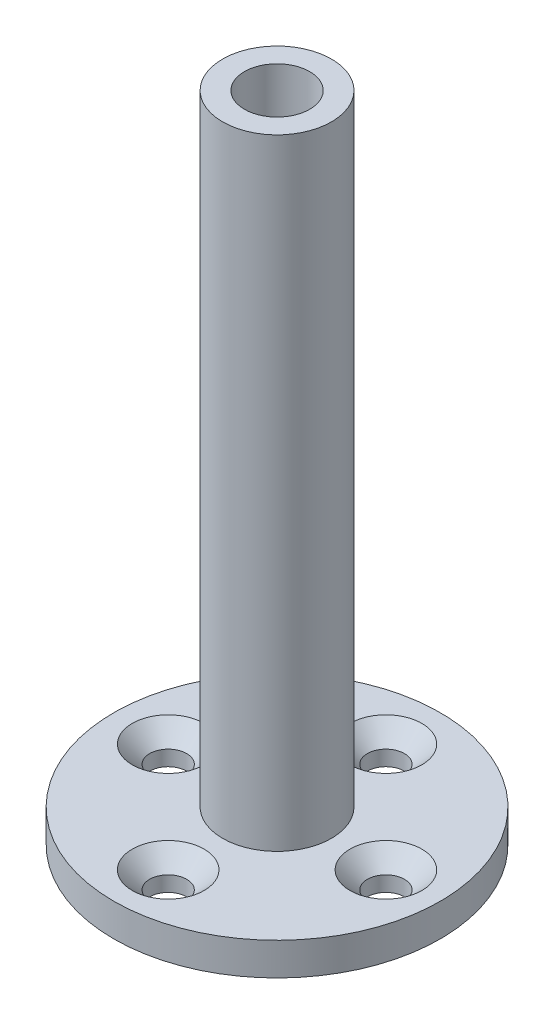
ISO-10303-21;
HEADER;
FILE_DESCRIPTION(('STEP AP214'),'2;1');
FILE_NAME('part.step','',(''),(''),'','','');
FILE_SCHEMA(('AUTOMOTIVE_DESIGN { 1 0 10303 214 1 1 1 1 }'));
ENDSEC;
DATA;
#1=APPLICATION_CONTEXT('core data for automotive mechanical design processes');
#2=APPLICATION_PROTOCOL_DEFINITION('international standard','automotive_design',2000,#1);
#3=PRODUCT_CONTEXT('',#1,'mechanical');
#4=PRODUCT('Part','Part','',(#3));
#5=PRODUCT_RELATED_PRODUCT_CATEGORY('part','',(#4));
#6=PRODUCT_DEFINITION_FORMATION('','',#4);
#7=PRODUCT_DEFINITION_CONTEXT('part definition',#1,'design');
#8=PRODUCT_DEFINITION('design','',#6,#7);
#9=PRODUCT_DEFINITION_SHAPE('','',#8);
#10=(LENGTH_UNIT() NAMED_UNIT(*) SI_UNIT(.MILLI.,.METRE.));
#11=(NAMED_UNIT(*) PLANE_ANGLE_UNIT() SI_UNIT($,.RADIAN.));
#12=(NAMED_UNIT(*) SI_UNIT($,.STERADIAN.) SOLID_ANGLE_UNIT());
#13=UNCERTAINTY_MEASURE_WITH_UNIT(LENGTH_MEASURE(1.E-05),#10,'distance_accuracy_value','');
#14=(GEOMETRIC_REPRESENTATION_CONTEXT(3) GLOBAL_UNCERTAINTY_ASSIGNED_CONTEXT((#13)) GLOBAL_UNIT_ASSIGNED_CONTEXT((#10,
#11,#12)) REPRESENTATION_CONTEXT('',''));
#15=CARTESIAN_POINT('',(0.,0.,0.));
#16=DIRECTION('',(0.,0.,1.));
#17=DIRECTION('',(1.,0.,0.));
#18=AXIS2_PLACEMENT_3D('',#15,#16,#17);
#19=CARTESIAN_POINT('',(0.,60.,0.));
#20=DIRECTION('',(0.,-1.,0.));
#21=DIRECTION('',(0.,0.,-1.));
#22=AXIS2_PLACEMENT_3D('',#19,#20,#21);
#23=CYLINDRICAL_SURFACE('',#22,3.);
#24=CARTESIAN_POINT('',(0.,60.,0.));
#25=DIRECTION('',(0.,1.,0.));
#26=DIRECTION('',(0.,0.,1.));
#27=AXIS2_PLACEMENT_3D('',#24,#25,#26);
#28=CIRCLE('',#27,3.);
#29=CARTESIAN_POINT('',(0.,60.,3.));
#30=VERTEX_POINT('',#29);
#31=EDGE_CURVE('E38',#30,#30,#28,.T.);
#32=ORIENTED_EDGE('',*,*,#31,.T.);
#33=EDGE_LOOP('',(#32));
#34=FACE_BOUND('',#33,.T.);
#35=CARTESIAN_POINT('',(0.,0.,0.));
#36=DIRECTION('',(0.,1.,0.));
#37=DIRECTION('',(0.,0.,1.));
#38=AXIS2_PLACEMENT_3D('',#35,#36,#37);
#39=CIRCLE('',#38,3.);
#40=CARTESIAN_POINT('',(0.,0.,3.));
#41=VERTEX_POINT('',#40);
#42=EDGE_CURVE('E34',#41,#41,#39,.T.);
#43=ORIENTED_EDGE('',*,*,#42,.F.);
#44=EDGE_LOOP('',(#43));
#45=FACE_BOUND('',#44,.T.);
#46=ADVANCED_FACE('F31',(#34,#45),#23,.F.);
#47=CARTESIAN_POINT('',(0.,60.,0.));
#48=DIRECTION('',(0.,-1.,0.));
#49=DIRECTION('',(0.,0.,-1.));
#50=AXIS2_PLACEMENT_3D('',#47,#48,#49);
#51=CYLINDRICAL_SURFACE('',#50,5.);
#52=CARTESIAN_POINT('',(0.,3.,0.));
#53=DIRECTION('',(0.,1.,0.));
#54=DIRECTION('',(0.,0.,1.));
#55=AXIS2_PLACEMENT_3D('',#52,#53,#54);
#56=CIRCLE('',#55,5.);
#57=CARTESIAN_POINT('',(0.,3.,5.));
#58=VERTEX_POINT('',#57);
#59=EDGE_CURVE('E48',#58,#58,#56,.T.);
#60=ORIENTED_EDGE('',*,*,#59,.T.);
#61=EDGE_LOOP('',(#60));
#62=FACE_BOUND('',#61,.T.);
#63=CARTESIAN_POINT('',(0.,60.,0.));
#64=DIRECTION('',(0.,1.,0.));
#65=DIRECTION('',(0.,0.,1.));
#66=AXIS2_PLACEMENT_3D('',#63,#64,#65);
#67=CIRCLE('',#66,5.);
#68=CARTESIAN_POINT('',(0.,60.,5.));
#69=VERTEX_POINT('',#68);
#70=EDGE_CURVE('E10',#69,#69,#67,.T.);
#71=ORIENTED_EDGE('',*,*,#70,.F.);
#72=EDGE_LOOP('',(#71));
#73=FACE_BOUND('',#72,.T.);
#74=ADVANCED_FACE('F108',(#62,#73),#51,.T.);
#75=CARTESIAN_POINT('',(0.,60.,0.));
#76=DIRECTION('',(0.,1.,0.));
#77=DIRECTION('',(0.,0.,1.));
#78=AXIS2_PLACEMENT_3D('',#75,#76,#77);
#79=PLANE('',#78);
#80=ORIENTED_EDGE('',*,*,#31,.F.);
#81=EDGE_LOOP('',(#80));
#82=FACE_BOUND('',#81,.T.);
#83=ORIENTED_EDGE('',*,*,#70,.T.);
#84=EDGE_LOOP('',(#83));
#85=FACE_BOUND('',#84,.T.);
#86=ADVANCED_FACE('F111',(#82,#85),#79,.T.);
#87=CARTESIAN_POINT('',(0.,0.,0.));
#88=DIRECTION('',(0.,1.,0.));
#89=DIRECTION('',(0.,0.,1.));
#90=AXIS2_PLACEMENT_3D('',#87,#88,#89);
#91=PLANE('',#90);
#92=CARTESIAN_POINT('',(-10.,0.,0.));
#93=DIRECTION('',(0.,1.,0.));
#94=DIRECTION('',(0.,0.,1.));
#95=AXIS2_PLACEMENT_3D('',#92,#93,#94);
#96=CIRCLE('',#95,1.7);
#97=CARTESIAN_POINT('',(-10.,0.,1.7));
#98=VERTEX_POINT('',#97);
#99=EDGE_CURVE('E80',#98,#98,#96,.T.);
#100=ORIENTED_EDGE('',*,*,#99,.T.);
#101=EDGE_LOOP('',(#100));
#102=FACE_BOUND('',#101,.T.);
#103=CARTESIAN_POINT('',(0.,0.,10.));
#104=DIRECTION('',(0.,1.,0.));
#105=DIRECTION('',(0.,0.,1.));
#106=AXIS2_PLACEMENT_3D('',#103,#104,#105);
#107=CIRCLE('',#106,1.7);
#108=CARTESIAN_POINT('',(0.,0.,11.7));
#109=VERTEX_POINT('',#108);
#110=EDGE_CURVE('E71',#109,#109,#107,.T.);
#111=ORIENTED_EDGE('',*,*,#110,.T.);
#112=EDGE_LOOP('',(#111));
#113=FACE_BOUND('',#112,.T.);
#114=CARTESIAN_POINT('',(10.,0.,0.));
#115=DIRECTION('',(0.,1.,0.));
#116=DIRECTION('',(0.,0.,1.));
#117=AXIS2_PLACEMENT_3D('',#114,#115,#116);
#118=CIRCLE('',#117,1.7);
#119=CARTESIAN_POINT('',(10.,0.,1.7));
#120=VERTEX_POINT('',#119);
#121=EDGE_CURVE('E62',#120,#120,#118,.T.);
#122=ORIENTED_EDGE('',*,*,#121,.T.);
#123=EDGE_LOOP('',(#122));
#124=FACE_BOUND('',#123,.T.);
#125=CARTESIAN_POINT('',(0.,0.,-10.));
#126=DIRECTION('',(0.,1.,0.));
#127=DIRECTION('',(0.,0.,1.));
#128=AXIS2_PLACEMENT_3D('',#125,#126,#127);
#129=CIRCLE('',#128,1.7);
#130=CARTESIAN_POINT('',(0.,0.,-8.3));
#131=VERTEX_POINT('',#130);
#132=EDGE_CURVE('E53',#131,#131,#129,.T.);
#133=ORIENTED_EDGE('',*,*,#132,.T.);
#134=EDGE_LOOP('',(#133));
#135=FACE_BOUND('',#134,.T.);
#136=ORIENTED_EDGE('',*,*,#42,.T.);
#137=EDGE_LOOP('',(#136));
#138=FACE_BOUND('',#137,.T.);
#139=CARTESIAN_POINT('',(0.,0.,0.));
#140=DIRECTION('',(0.,1.,0.));
#141=DIRECTION('',(0.,0.,1.));
#142=AXIS2_PLACEMENT_3D('',#139,#140,#141);
#143=CIRCLE('',#142,15.);
#144=CARTESIAN_POINT('',(0.,0.,15.));
#145=VERTEX_POINT('',#144);
#146=EDGE_CURVE('E44',#145,#145,#143,.T.);
#147=ORIENTED_EDGE('',*,*,#146,.F.);
#148=EDGE_LOOP('',(#147));
#149=FACE_BOUND('',#148,.T.);
#150=ADVANCED_FACE('F96',(#102,#113,#124,#135,#138,#149),#91,.F.);
#151=CARTESIAN_POINT('',(0.,3.,0.));
#152=DIRECTION('',(0.,1.,0.));
#153=DIRECTION('',(0.,0.,1.));
#154=AXIS2_PLACEMENT_3D('',#151,#152,#153);
#155=PLANE('',#154);
#156=CARTESIAN_POINT('',(-10.,3.,0.));
#157=DIRECTION('',(0.,1.,0.));
#158=DIRECTION('',(0.,0.,1.));
#159=AXIS2_PLACEMENT_3D('',#156,#157,#158);
#160=CIRCLE('',#159,3.3);
#161=CARTESIAN_POINT('',(-10.,3.,3.3));
#162=VERTEX_POINT('',#161);
#163=EDGE_CURVE('E86',#162,#162,#160,.T.);
#164=ORIENTED_EDGE('',*,*,#163,.F.);
#165=EDGE_LOOP('',(#164));
#166=FACE_BOUND('',#165,.T.);
#167=CARTESIAN_POINT('',(0.,3.,10.));
#168=DIRECTION('',(0.,1.,0.));
#169=DIRECTION('',(0.,0.,1.));
#170=AXIS2_PLACEMENT_3D('',#167,#168,#169);
#171=CIRCLE('',#170,3.3);
#172=CARTESIAN_POINT('',(0.,3.,13.3));
#173=VERTEX_POINT('',#172);
#174=EDGE_CURVE('E77',#173,#173,#171,.T.);
#175=ORIENTED_EDGE('',*,*,#174,.F.);
#176=EDGE_LOOP('',(#175));
#177=FACE_BOUND('',#176,.T.);
#178=CARTESIAN_POINT('',(10.,3.,0.));
#179=DIRECTION('',(0.,1.,0.));
#180=DIRECTION('',(0.,0.,1.));
#181=AXIS2_PLACEMENT_3D('',#178,#179,#180);
#182=CIRCLE('',#181,3.3);
#183=CARTESIAN_POINT('',(10.,3.,3.3));
#184=VERTEX_POINT('',#183);
#185=EDGE_CURVE('E68',#184,#184,#182,.T.);
#186=ORIENTED_EDGE('',*,*,#185,.F.);
#187=EDGE_LOOP('',(#186));
#188=FACE_BOUND('',#187,.T.);
#189=CARTESIAN_POINT('',(0.,3.,-10.));
#190=DIRECTION('',(0.,1.,0.));
#191=DIRECTION('',(0.,0.,1.));
#192=AXIS2_PLACEMENT_3D('',#189,#190,#191);
#193=CIRCLE('',#192,3.3);
#194=CARTESIAN_POINT('',(0.,3.,-6.7));
#195=VERTEX_POINT('',#194);
#196=EDGE_CURVE('E59',#195,#195,#193,.T.);
#197=ORIENTED_EDGE('',*,*,#196,.F.);
#198=EDGE_LOOP('',(#197));
#199=FACE_BOUND('',#198,.T.);
#200=CARTESIAN_POINT('',(0.,3.,0.));
#201=DIRECTION('',(0.,1.,0.));
#202=DIRECTION('',(0.,0.,1.));
#203=AXIS2_PLACEMENT_3D('',#200,#201,#202);
#204=CIRCLE('',#203,15.);
#205=CARTESIAN_POINT('',(0.,3.,15.));
#206=VERTEX_POINT('',#205);
#207=EDGE_CURVE('E47',#206,#206,#204,.T.);
#208=ORIENTED_EDGE('',*,*,#207,.T.);
#209=EDGE_LOOP('',(#208));
#210=FACE_BOUND('',#209,.T.);
#211=ORIENTED_EDGE('',*,*,#59,.F.);
#212=EDGE_LOOP('',(#211));
#213=FACE_BOUND('',#212,.T.);
#214=ADVANCED_FACE('F92',(#166,#177,#188,#199,#210,#213),#155,.T.);
#215=CARTESIAN_POINT('',(0.,3.,0.));
#216=DIRECTION('',(0.,-1.,0.));
#217=DIRECTION('',(0.,0.,-1.));
#218=AXIS2_PLACEMENT_3D('',#215,#216,#217);
#219=CYLINDRICAL_SURFACE('',#218,15.);
#220=ORIENTED_EDGE('',*,*,#207,.F.);
#221=EDGE_LOOP('',(#220));
#222=FACE_BOUND('',#221,.T.);
#223=ORIENTED_EDGE('',*,*,#146,.T.);
#224=EDGE_LOOP('',(#223));
#225=FACE_BOUND('',#224,.T.);
#226=ADVANCED_FACE('F95',(#222,#225),#219,.T.);
#227=CARTESIAN_POINT('',(0.,3.,-10.));
#228=DIRECTION('',(0.,1.,0.));
#229=DIRECTION('',(0.,0.,1.));
#230=AXIS2_PLACEMENT_3D('',#227,#228,#229);
#231=CYLINDRICAL_SURFACE('',#230,1.7);
#232=ORIENTED_EDGE('',*,*,#132,.F.);
#233=EDGE_LOOP('',(#232));
#234=FACE_BOUND('',#233,.T.);
#235=CARTESIAN_POINT('',(0.,1.4,-10.));
#236=DIRECTION('',(0.,1.,0.));
#237=DIRECTION('',(0.,0.,1.));
#238=AXIS2_PLACEMENT_3D('',#235,#236,#237);
#239=CIRCLE('',#238,1.7);
#240=CARTESIAN_POINT('',(0.,1.4,-8.3));
#241=VERTEX_POINT('',#240);
#242=EDGE_CURVE('E56',#241,#241,#239,.T.);
#243=ORIENTED_EDGE('',*,*,#242,.T.);
#244=EDGE_LOOP('',(#243));
#245=FACE_BOUND('',#244,.T.);
#246=ADVANCED_FACE('F124',(#234,#245),#231,.F.);
#247=CARTESIAN_POINT('',(0.,3.,-10.));
#248=DIRECTION('',(0.,1.,0.));
#249=DIRECTION('',(0.,0.,1.));
#250=AXIS2_PLACEMENT_3D('',#247,#248,#249);
#251=CONICAL_SURFACE('',#250,3.3,0.785398163397449);
#252=ORIENTED_EDGE('',*,*,#242,.F.);
#253=EDGE_LOOP('',(#252));
#254=FACE_BOUND('',#253,.T.);
#255=ORIENTED_EDGE('',*,*,#196,.T.);
#256=EDGE_LOOP('',(#255));
#257=FACE_BOUND('',#256,.T.);
#258=ADVANCED_FACE('F129',(#254,#257),#251,.F.);
#259=CARTESIAN_POINT('',(10.,3.,0.));
#260=DIRECTION('',(0.,1.,0.));
#261=DIRECTION('',(0.,0.,1.));
#262=AXIS2_PLACEMENT_3D('',#259,#260,#261);
#263=CYLINDRICAL_SURFACE('',#262,1.7);
#264=ORIENTED_EDGE('',*,*,#121,.F.);
#265=EDGE_LOOP('',(#264));
#266=FACE_BOUND('',#265,.T.);
#267=CARTESIAN_POINT('',(10.,1.4,0.));
#268=DIRECTION('',(0.,1.,0.));
#269=DIRECTION('',(0.,0.,1.));
#270=AXIS2_PLACEMENT_3D('',#267,#268,#269);
#271=CIRCLE('',#270,1.7);
#272=CARTESIAN_POINT('',(10.,1.4,1.7));
#273=VERTEX_POINT('',#272);
#274=EDGE_CURVE('E65',#273,#273,#271,.T.);
#275=ORIENTED_EDGE('',*,*,#274,.T.);
#276=EDGE_LOOP('',(#275));
#277=FACE_BOUND('',#276,.T.);
#278=ADVANCED_FACE('F133',(#266,#277),#263,.F.);
#279=CARTESIAN_POINT('',(10.,3.,0.));
#280=DIRECTION('',(0.,1.,0.));
#281=DIRECTION('',(0.,0.,1.));
#282=AXIS2_PLACEMENT_3D('',#279,#280,#281);
#283=CONICAL_SURFACE('',#282,3.3,0.785398163397448);
#284=ORIENTED_EDGE('',*,*,#274,.F.);
#285=EDGE_LOOP('',(#284));
#286=FACE_BOUND('',#285,.T.);
#287=ORIENTED_EDGE('',*,*,#185,.T.);
#288=EDGE_LOOP('',(#287));
#289=FACE_BOUND('',#288,.T.);
#290=ADVANCED_FACE('F137',(#286,#289),#283,.F.);
#291=CARTESIAN_POINT('',(0.,3.,10.));
#292=DIRECTION('',(0.,1.,0.));
#293=DIRECTION('',(0.,0.,1.));
#294=AXIS2_PLACEMENT_3D('',#291,#292,#293);
#295=CYLINDRICAL_SURFACE('',#294,1.7);
#296=ORIENTED_EDGE('',*,*,#110,.F.);
#297=EDGE_LOOP('',(#296));
#298=FACE_BOUND('',#297,.T.);
#299=CARTESIAN_POINT('',(0.,1.4,10.));
#300=DIRECTION('',(0.,1.,0.));
#301=DIRECTION('',(0.,0.,1.));
#302=AXIS2_PLACEMENT_3D('',#299,#300,#301);
#303=CIRCLE('',#302,1.7);
#304=CARTESIAN_POINT('',(0.,1.4,11.7));
#305=VERTEX_POINT('',#304);
#306=EDGE_CURVE('E74',#305,#305,#303,.T.);
#307=ORIENTED_EDGE('',*,*,#306,.T.);
#308=EDGE_LOOP('',(#307));
#309=FACE_BOUND('',#308,.T.);
#310=ADVANCED_FACE('F141',(#298,#309),#295,.F.);
#311=CARTESIAN_POINT('',(0.,3.,10.));
#312=DIRECTION('',(0.,1.,0.));
#313=DIRECTION('',(0.,0.,1.));
#314=AXIS2_PLACEMENT_3D('',#311,#312,#313);
#315=CONICAL_SURFACE('',#314,3.3,0.785398163397449);
#316=ORIENTED_EDGE('',*,*,#306,.F.);
#317=EDGE_LOOP('',(#316));
#318=FACE_BOUND('',#317,.T.);
#319=ORIENTED_EDGE('',*,*,#174,.T.);
#320=EDGE_LOOP('',(#319));
#321=FACE_BOUND('',#320,.T.);
#322=ADVANCED_FACE('F145',(#318,#321),#315,.F.);
#323=CARTESIAN_POINT('',(-10.,3.,0.));
#324=DIRECTION('',(0.,1.,0.));
#325=DIRECTION('',(0.,0.,1.));
#326=AXIS2_PLACEMENT_3D('',#323,#324,#325);
#327=CYLINDRICAL_SURFACE('',#326,1.7);
#328=ORIENTED_EDGE('',*,*,#99,.F.);
#329=EDGE_LOOP('',(#328));
#330=FACE_BOUND('',#329,.T.);
#331=CARTESIAN_POINT('',(-10.,1.4,0.));
#332=DIRECTION('',(0.,1.,0.));
#333=DIRECTION('',(0.,0.,1.));
#334=AXIS2_PLACEMENT_3D('',#331,#332,#333);
#335=CIRCLE('',#334,1.7);
#336=CARTESIAN_POINT('',(-10.,1.4,1.7));
#337=VERTEX_POINT('',#336);
#338=EDGE_CURVE('E83',#337,#337,#335,.T.);
#339=ORIENTED_EDGE('',*,*,#338,.T.);
#340=EDGE_LOOP('',(#339));
#341=FACE_BOUND('',#340,.T.);
#342=ADVANCED_FACE('F149',(#330,#341),#327,.F.);
#343=CARTESIAN_POINT('',(-10.,3.,0.));
#344=DIRECTION('',(0.,1.,0.));
#345=DIRECTION('',(0.,0.,1.));
#346=AXIS2_PLACEMENT_3D('',#343,#344,#345);
#347=CONICAL_SURFACE('',#346,3.3,0.785398163397449);
#348=ORIENTED_EDGE('',*,*,#338,.F.);
#349=EDGE_LOOP('',(#348));
#350=FACE_BOUND('',#349,.T.);
#351=ORIENTED_EDGE('',*,*,#163,.T.);
#352=EDGE_LOOP('',(#351));
#353=FACE_BOUND('',#352,.T.);
#354=ADVANCED_FACE('F90',(#350,#353),#347,.F.);
#355=CLOSED_SHELL('',(#46,#74,#86,#150,#214,#226,#246,#258,#278,#290,#310,#322,#342,#354));
#356=MANIFOLD_SOLID_BREP('B2',#355);
#357=ADVANCED_BREP_SHAPE_REPRESENTATION('',(#18,#356),#14);
#358=SHAPE_DEFINITION_REPRESENTATION(#9,#357);
ENDSEC;
END-ISO-10303-21;
